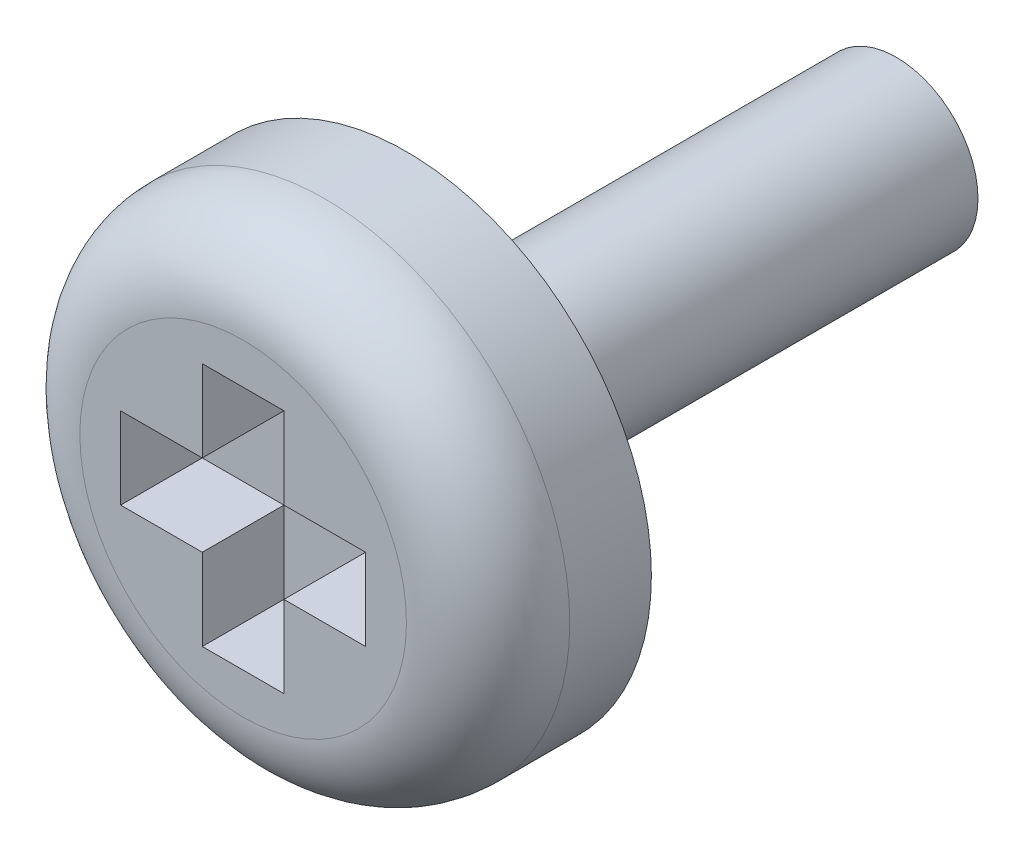
ISO-10303-21;
HEADER;
FILE_DESCRIPTION(('STEP AP214'),'2;1');
FILE_NAME('part.step','',(''),(''),'','','');
FILE_SCHEMA(('AUTOMOTIVE_DESIGN { 1 0 10303 214 1 1 1 1 }'));
ENDSEC;
DATA;
#1=APPLICATION_CONTEXT('core data for automotive mechanical design processes');
#2=APPLICATION_PROTOCOL_DEFINITION('international standard','automotive_design',2000,#1);
#3=PRODUCT_CONTEXT('',#1,'mechanical');
#4=PRODUCT('Part','Part','',(#3));
#5=PRODUCT_RELATED_PRODUCT_CATEGORY('part','',(#4));
#6=PRODUCT_DEFINITION_FORMATION('','',#4);
#7=PRODUCT_DEFINITION_CONTEXT('part definition',#1,'design');
#8=PRODUCT_DEFINITION('design','',#6,#7);
#9=PRODUCT_DEFINITION_SHAPE('','',#8);
#10=(LENGTH_UNIT() NAMED_UNIT(*) SI_UNIT(.MILLI.,.METRE.));
#11=(NAMED_UNIT(*) PLANE_ANGLE_UNIT() SI_UNIT($,.RADIAN.));
#12=(NAMED_UNIT(*) SI_UNIT($,.STERADIAN.) SOLID_ANGLE_UNIT());
#13=UNCERTAINTY_MEASURE_WITH_UNIT(LENGTH_MEASURE(1.E-05),#10,'distance_accuracy_value','');
#14=(GEOMETRIC_REPRESENTATION_CONTEXT(3) GLOBAL_UNCERTAINTY_ASSIGNED_CONTEXT((#13)) GLOBAL_UNIT_ASSIGNED_CONTEXT((#10,
#11,#12)) REPRESENTATION_CONTEXT('',''));
#15=CARTESIAN_POINT('',(0.,0.,0.));
#16=DIRECTION('',(0.,0.,1.));
#17=DIRECTION('',(1.,0.,0.));
#18=AXIS2_PLACEMENT_3D('',#15,#16,#17);
#19=CARTESIAN_POINT('',(0.,0.,3.));
#20=DIRECTION('',(0.,0.,-1.));
#21=DIRECTION('',(-1.,0.,0.));
#22=AXIS2_PLACEMENT_3D('',#19,#20,#21);
#23=CYLINDRICAL_SURFACE('',#22,0.5);
#24=CARTESIAN_POINT('',(0.,0.,3.));
#25=DIRECTION('',(0.,0.,1.));
#26=DIRECTION('',(1.,0.,0.));
#27=AXIS2_PLACEMENT_3D('',#24,#25,#26);
#28=CIRCLE('',#27,0.5);
#29=CARTESIAN_POINT('',(0.5,0.,3.));
#30=VERTEX_POINT('',#29);
#31=EDGE_CURVE('E211',#30,#30,#28,.T.);
#32=ORIENTED_EDGE('',*,*,#31,.F.);
#33=EDGE_LOOP('',(#32));
#34=FACE_BOUND('',#33,.T.);
#35=CARTESIAN_POINT('',(0.,0.,0.));
#36=DIRECTION('',(0.,0.,1.));
#37=DIRECTION('',(1.,0.,0.));
#38=AXIS2_PLACEMENT_3D('',#35,#36,#37);
#39=CIRCLE('',#38,0.5);
#40=CARTESIAN_POINT('',(0.5,0.,0.));
#41=VERTEX_POINT('',#40);
#42=EDGE_CURVE('E210',#41,#41,#39,.T.);
#43=ORIENTED_EDGE('',*,*,#42,.T.);
#44=EDGE_LOOP('',(#43));
#45=FACE_BOUND('',#44,.T.);
#46=ADVANCED_FACE('F34',(#34,#45),#23,.T.);
#47=CARTESIAN_POINT('',(0.,0.,0.));
#48=DIRECTION('',(0.,0.,1.));
#49=DIRECTION('',(1.,0.,0.));
#50=AXIS2_PLACEMENT_3D('',#47,#48,#49);
#51=PLANE('',#50);
#52=ORIENTED_EDGE('',*,*,#42,.F.);
#53=EDGE_LOOP('',(#52));
#54=FACE_BOUND('',#53,.T.);
#55=ADVANCED_FACE('F234',(#54),#51,.F.);
#56=CARTESIAN_POINT('',(0.,0.,4.));
#57=DIRECTION('',(0.,0.,-1.));
#58=DIRECTION('',(-1.,0.,0.));
#59=AXIS2_PLACEMENT_3D('',#56,#57,#58);
#60=CYLINDRICAL_SURFACE('',#59,1.5);
#61=CARTESIAN_POINT('',(0.,0.,3.5));
#62=DIRECTION('',(0.,0.,1.));
#63=DIRECTION('',(1.,0.,0.));
#64=AXIS2_PLACEMENT_3D('',#61,#62,#63);
#65=CIRCLE('',#64,1.5);
#66=CARTESIAN_POINT('',(1.5,0.,3.5));
#67=VERTEX_POINT('',#66);
#68=EDGE_CURVE('E11',#67,#67,#65,.F.);
#69=ORIENTED_EDGE('',*,*,#68,.T.);
#70=EDGE_LOOP('',(#69));
#71=FACE_BOUND('',#70,.T.);
#72=CARTESIAN_POINT('',(0.,0.,3.));
#73=DIRECTION('',(0.,0.,1.));
#74=DIRECTION('',(1.,0.,0.));
#75=AXIS2_PLACEMENT_3D('',#72,#73,#74);
#76=CIRCLE('',#75,1.5);
#77=CARTESIAN_POINT('',(1.5,0.,3.));
#78=VERTEX_POINT('',#77);
#79=EDGE_CURVE('E190',#78,#78,#76,.T.);
#80=ORIENTED_EDGE('',*,*,#79,.T.);
#81=EDGE_LOOP('',(#80));
#82=FACE_BOUND('',#81,.T.);
#83=ADVANCED_FACE('F239',(#71,#82),#60,.T.);
#84=CARTESIAN_POINT('',(0.,0.,4.));
#85=DIRECTION('',(0.,0.,1.));
#86=DIRECTION('',(1.,0.,0.));
#87=AXIS2_PLACEMENT_3D('',#84,#85,#86);
#88=PLANE('',#87);
#89=DIRECTION('',(0.,-1.,0.));
#90=VECTOR('',#89,1.);
#91=CARTESIAN_POINT('',(-0.75,0.25,4.));
#92=LINE('',#91,#90);
#93=CARTESIAN_POINT('',(-0.75,0.25,4.));
#94=VERTEX_POINT('',#93);
#95=CARTESIAN_POINT('',(-0.75,-0.25,4.));
#96=VERTEX_POINT('',#95);
#97=EDGE_CURVE('E49',#94,#96,#92,.T.);
#98=ORIENTED_EDGE('',*,*,#97,.F.);
#99=DIRECTION('',(-1.,0.,0.));
#100=VECTOR('',#99,1.);
#101=CARTESIAN_POINT('',(-0.75,0.25,4.));
#102=LINE('',#101,#100);
#103=CARTESIAN_POINT('',(-0.25,0.25,4.));
#104=VERTEX_POINT('',#103);
#105=EDGE_CURVE('E186',#104,#94,#102,.T.);
#106=ORIENTED_EDGE('',*,*,#105,.F.);
#107=DIRECTION('',(0.,-1.,0.));
#108=VECTOR('',#107,1.);
#109=CARTESIAN_POINT('',(-0.25,0.75,4.));
#110=LINE('',#109,#108);
#111=CARTESIAN_POINT('',(-0.25,0.75,4.));
#112=VERTEX_POINT('',#111);
#113=EDGE_CURVE('E184',#112,#104,#110,.T.);
#114=ORIENTED_EDGE('',*,*,#113,.F.);
#115=DIRECTION('',(-1.,0.,0.));
#116=VECTOR('',#115,1.);
#117=CARTESIAN_POINT('',(-0.25,0.75,4.));
#118=LINE('',#117,#116);
#119=CARTESIAN_POINT('',(0.25,0.75,4.));
#120=VERTEX_POINT('',#119);
#121=EDGE_CURVE('E133',#120,#112,#118,.T.);
#122=ORIENTED_EDGE('',*,*,#121,.F.);
#123=DIRECTION('',(0.,1.,0.));
#124=VECTOR('',#123,1.);
#125=CARTESIAN_POINT('',(0.25,0.75,4.));
#126=LINE('',#125,#124);
#127=CARTESIAN_POINT('',(0.25,0.25,4.));
#128=VERTEX_POINT('',#127);
#129=EDGE_CURVE('E180',#128,#120,#126,.T.);
#130=ORIENTED_EDGE('',*,*,#129,.F.);
#131=DIRECTION('',(-1.,0.,0.));
#132=VECTOR('',#131,1.);
#133=CARTESIAN_POINT('',(0.25,0.25,4.));
#134=LINE('',#133,#132);
#135=CARTESIAN_POINT('',(0.75,0.25,4.));
#136=VERTEX_POINT('',#135);
#137=EDGE_CURVE('E177',#136,#128,#134,.T.);
#138=ORIENTED_EDGE('',*,*,#137,.F.);
#139=DIRECTION('',(0.,1.,0.));
#140=VECTOR('',#139,1.);
#141=CARTESIAN_POINT('',(0.75,0.25,4.));
#142=LINE('',#141,#140);
#143=CARTESIAN_POINT('',(0.75,-0.25,4.));
#144=VERTEX_POINT('',#143);
#145=EDGE_CURVE('E174',#144,#136,#142,.T.);
#146=ORIENTED_EDGE('',*,*,#145,.F.);
#147=DIRECTION('',(1.,0.,0.));
#148=VECTOR('',#147,1.);
#149=CARTESIAN_POINT('',(0.25,-0.25,4.));
#150=LINE('',#149,#148);
#151=CARTESIAN_POINT('',(0.25,-0.25,4.));
#152=VERTEX_POINT('',#151);
#153=EDGE_CURVE('E171',#152,#144,#150,.T.);
#154=ORIENTED_EDGE('',*,*,#153,.F.);
#155=DIRECTION('',(0.,1.,0.));
#156=VECTOR('',#155,1.);
#157=CARTESIAN_POINT('',(0.25,-0.25,4.));
#158=LINE('',#157,#156);
#159=CARTESIAN_POINT('',(0.25,-0.75,4.));
#160=VERTEX_POINT('',#159);
#161=EDGE_CURVE('E168',#160,#152,#158,.T.);
#162=ORIENTED_EDGE('',*,*,#161,.F.);
#163=DIRECTION('',(1.,0.,0.));
#164=VECTOR('',#163,1.);
#165=CARTESIAN_POINT('',(-0.25,-0.75,4.));
#166=LINE('',#165,#164);
#167=CARTESIAN_POINT('',(-0.25,-0.75,4.));
#168=VERTEX_POINT('',#167);
#169=EDGE_CURVE('E165',#168,#160,#166,.T.);
#170=ORIENTED_EDGE('',*,*,#169,.F.);
#171=DIRECTION('',(0.,-1.,0.));
#172=VECTOR('',#171,1.);
#173=CARTESIAN_POINT('',(-0.25,-0.25,4.));
#174=LINE('',#173,#172);
#175=CARTESIAN_POINT('',(-0.25,-0.25,4.));
#176=VERTEX_POINT('',#175);
#177=EDGE_CURVE('E162',#176,#168,#174,.T.);
#178=ORIENTED_EDGE('',*,*,#177,.F.);
#179=DIRECTION('',(1.,0.,0.));
#180=VECTOR('',#179,1.);
#181=CARTESIAN_POINT('',(-0.75,-0.25,4.));
#182=LINE('',#181,#180);
#183=EDGE_CURVE('E159',#96,#176,#182,.T.);
#184=ORIENTED_EDGE('',*,*,#183,.F.);
#185=EDGE_LOOP('',(#98,#106,#114,#122,#130,#138,#146,#154,#162,#170,#178,#184));
#186=FACE_BOUND('',#185,.T.);
#187=CARTESIAN_POINT('',(0.,0.,4.));
#188=DIRECTION('',(0.,0.,1.));
#189=DIRECTION('',(1.,0.,0.));
#190=AXIS2_PLACEMENT_3D('',#187,#188,#189);
#191=CIRCLE('',#190,1.);
#192=CARTESIAN_POINT('',(1.,0.,4.));
#193=VERTEX_POINT('',#192);
#194=EDGE_CURVE('E42',#193,#193,#191,.T.);
#195=ORIENTED_EDGE('',*,*,#194,.T.);
#196=EDGE_LOOP('',(#195));
#197=FACE_BOUND('',#196,.T.);
#198=ADVANCED_FACE('F218',(#186,#197),#88,.T.);
#199=CARTESIAN_POINT('',(0.,0.,3.));
#200=DIRECTION('',(0.,0.,1.));
#201=DIRECTION('',(1.,0.,0.));
#202=AXIS2_PLACEMENT_3D('',#199,#200,#201);
#203=PLANE('',#202);
#204=ORIENTED_EDGE('',*,*,#31,.T.);
#205=EDGE_LOOP('',(#204));
#206=FACE_BOUND('',#205,.T.);
#207=ORIENTED_EDGE('',*,*,#79,.F.);
#208=EDGE_LOOP('',(#207));
#209=FACE_BOUND('',#208,.T.);
#210=ADVANCED_FACE('F222',(#206,#209),#203,.F.);
#211=CARTESIAN_POINT('',(0.,0.,3.5));
#212=DIRECTION('',(0.,0.,1.));
#213=DIRECTION('',(1.,0.,0.));
#214=AXIS2_PLACEMENT_3D('',#211,#212,#213);
#215=TOROIDAL_SURFACE('',#214,1.,0.5);
#216=ORIENTED_EDGE('',*,*,#68,.F.);
#217=EDGE_LOOP('',(#216));
#218=FACE_BOUND('',#217,.T.);
#219=ORIENTED_EDGE('',*,*,#194,.F.);
#220=EDGE_LOOP('',(#219));
#221=FACE_BOUND('',#220,.T.);
#222=ADVANCED_FACE('F36',(#218,#221),#215,.T.);
#223=CARTESIAN_POINT('',(-0.75,0.25,3.5));
#224=DIRECTION('',(-1.,0.,0.));
#225=DIRECTION('',(0.,-1.,0.));
#226=AXIS2_PLACEMENT_3D('',#223,#224,#225);
#227=PLANE('',#226);
#228=ORIENTED_EDGE('',*,*,#97,.T.);
#229=DIRECTION('',(0.,0.,1.));
#230=VECTOR('',#229,1.);
#231=CARTESIAN_POINT('',(-0.75,-0.25,3.5));
#232=LINE('',#231,#230);
#233=CARTESIAN_POINT('',(-0.75,-0.25,3.5));
#234=VERTEX_POINT('',#233);
#235=EDGE_CURVE('E97',#234,#96,#232,.T.);
#236=ORIENTED_EDGE('',*,*,#235,.F.);
#237=DIRECTION('',(0.,-1.,0.));
#238=VECTOR('',#237,1.);
#239=CARTESIAN_POINT('',(-0.75,0.25,3.5));
#240=LINE('',#239,#238);
#241=CARTESIAN_POINT('',(-0.75,0.25,3.5));
#242=VERTEX_POINT('',#241);
#243=EDGE_CURVE('E188',#242,#234,#240,.T.);
#244=ORIENTED_EDGE('',*,*,#243,.F.);
#245=DIRECTION('',(0.,0.,1.));
#246=VECTOR('',#245,1.);
#247=CARTESIAN_POINT('',(-0.75,0.25,3.5));
#248=LINE('',#247,#246);
#249=EDGE_CURVE('E57',#242,#94,#248,.T.);
#250=ORIENTED_EDGE('',*,*,#249,.T.);
#251=EDGE_LOOP('',(#228,#236,#244,#250));
#252=FACE_BOUND('',#251,.T.);
#253=ADVANCED_FACE('F221',(#252),#227,.F.);
#254=CARTESIAN_POINT('',(-0.75,0.25,3.5));
#255=DIRECTION('',(0.,1.,0.));
#256=DIRECTION('',(-1.,0.,0.));
#257=AXIS2_PLACEMENT_3D('',#254,#255,#256);
#258=PLANE('',#257);
#259=ORIENTED_EDGE('',*,*,#105,.T.);
#260=ORIENTED_EDGE('',*,*,#249,.F.);
#261=DIRECTION('',(-1.,0.,0.));
#262=VECTOR('',#261,1.);
#263=CARTESIAN_POINT('',(-0.75,0.25,3.5));
#264=LINE('',#263,#262);
#265=CARTESIAN_POINT('',(-0.25,0.25,3.5));
#266=VERTEX_POINT('',#265);
#267=EDGE_CURVE('E145',#266,#242,#264,.T.);
#268=ORIENTED_EDGE('',*,*,#267,.F.);
#269=DIRECTION('',(0.,0.,1.));
#270=VECTOR('',#269,1.);
#271=CARTESIAN_POINT('',(-0.25,0.25,3.5));
#272=LINE('',#271,#270);
#273=EDGE_CURVE('E137',#266,#104,#272,.T.);
#274=ORIENTED_EDGE('',*,*,#273,.T.);
#275=EDGE_LOOP('',(#259,#260,#268,#274));
#276=FACE_BOUND('',#275,.T.);
#277=ADVANCED_FACE('F228',(#276),#258,.F.);
#278=CARTESIAN_POINT('',(-0.25,0.75,3.5));
#279=DIRECTION('',(-1.,0.,0.));
#280=DIRECTION('',(0.,-1.,0.));
#281=AXIS2_PLACEMENT_3D('',#278,#279,#280);
#282=PLANE('',#281);
#283=ORIENTED_EDGE('',*,*,#113,.T.);
#284=ORIENTED_EDGE('',*,*,#273,.F.);
#285=DIRECTION('',(0.,-1.,0.));
#286=VECTOR('',#285,1.);
#287=CARTESIAN_POINT('',(-0.25,0.75,3.5));
#288=LINE('',#287,#286);
#289=CARTESIAN_POINT('',(-0.25,0.75,3.5));
#290=VERTEX_POINT('',#289);
#291=EDGE_CURVE('E141',#290,#266,#288,.T.);
#292=ORIENTED_EDGE('',*,*,#291,.F.);
#293=DIRECTION('',(0.,0.,1.));
#294=VECTOR('',#293,1.);
#295=CARTESIAN_POINT('',(-0.25,0.75,3.5));
#296=LINE('',#295,#294);
#297=EDGE_CURVE('E126',#290,#112,#296,.T.);
#298=ORIENTED_EDGE('',*,*,#297,.T.);
#299=EDGE_LOOP('',(#283,#284,#292,#298));
#300=FACE_BOUND('',#299,.T.);
#301=ADVANCED_FACE('F142',(#300),#282,.F.);
#302=CARTESIAN_POINT('',(-0.25,0.75,3.5));
#303=DIRECTION('',(0.,1.,0.));
#304=DIRECTION('',(0.,0.,1.));
#305=AXIS2_PLACEMENT_3D('',#302,#303,#304);
#306=PLANE('',#305);
#307=ORIENTED_EDGE('',*,*,#121,.T.);
#308=ORIENTED_EDGE('',*,*,#297,.F.);
#309=DIRECTION('',(-1.,0.,0.));
#310=VECTOR('',#309,1.);
#311=CARTESIAN_POINT('',(-0.25,0.75,3.5));
#312=LINE('',#311,#310);
#313=CARTESIAN_POINT('',(0.25,0.75,3.5));
#314=VERTEX_POINT('',#313);
#315=EDGE_CURVE('E130',#314,#290,#312,.T.);
#316=ORIENTED_EDGE('',*,*,#315,.F.);
#317=DIRECTION('',(0.,0.,1.));
#318=VECTOR('',#317,1.);
#319=CARTESIAN_POINT('',(0.25,0.75,3.5));
#320=LINE('',#319,#318);
#321=EDGE_CURVE('E138',#314,#120,#320,.T.);
#322=ORIENTED_EDGE('',*,*,#321,.T.);
#323=EDGE_LOOP('',(#307,#308,#316,#322));
#324=FACE_BOUND('',#323,.T.);
#325=ADVANCED_FACE('F128',(#324),#306,.F.);
#326=CARTESIAN_POINT('',(0.25,0.75,3.5));
#327=DIRECTION('',(1.,0.,0.));
#328=DIRECTION('',(0.,1.,0.));
#329=AXIS2_PLACEMENT_3D('',#326,#327,#328);
#330=PLANE('',#329);
#331=ORIENTED_EDGE('',*,*,#129,.T.);
#332=ORIENTED_EDGE('',*,*,#321,.F.);
#333=DIRECTION('',(0.,1.,0.));
#334=VECTOR('',#333,1.);
#335=CARTESIAN_POINT('',(0.25,0.75,3.5));
#336=LINE('',#335,#334);
#337=CARTESIAN_POINT('',(0.25,0.25,3.5));
#338=VERTEX_POINT('',#337);
#339=EDGE_CURVE('E151',#338,#314,#336,.T.);
#340=ORIENTED_EDGE('',*,*,#339,.F.);
#341=DIRECTION('',(0.,0.,1.));
#342=VECTOR('',#341,1.);
#343=CARTESIAN_POINT('',(0.25,0.25,3.5));
#344=LINE('',#343,#342);
#345=EDGE_CURVE('E193',#338,#128,#344,.T.);
#346=ORIENTED_EDGE('',*,*,#345,.T.);
#347=EDGE_LOOP('',(#331,#332,#340,#346));
#348=FACE_BOUND('',#347,.T.);
#349=ADVANCED_FACE('F278',(#348),#330,.F.);
#350=CARTESIAN_POINT('',(0.25,0.25,3.5));
#351=DIRECTION('',(0.,1.,0.));
#352=DIRECTION('',(-1.,0.,0.));
#353=AXIS2_PLACEMENT_3D('',#350,#351,#352);
#354=PLANE('',#353);
#355=ORIENTED_EDGE('',*,*,#137,.T.);
#356=ORIENTED_EDGE('',*,*,#345,.F.);
#357=DIRECTION('',(-1.,0.,0.));
#358=VECTOR('',#357,1.);
#359=CARTESIAN_POINT('',(0.25,0.25,3.5));
#360=LINE('',#359,#358);
#361=CARTESIAN_POINT('',(0.75,0.25,3.5));
#362=VERTEX_POINT('',#361);
#363=EDGE_CURVE('E153',#362,#338,#360,.T.);
#364=ORIENTED_EDGE('',*,*,#363,.F.);
#365=DIRECTION('',(0.,0.,1.));
#366=VECTOR('',#365,1.);
#367=CARTESIAN_POINT('',(0.75,0.25,3.5));
#368=LINE('',#367,#366);
#369=EDGE_CURVE('E195',#362,#136,#368,.T.);
#370=ORIENTED_EDGE('',*,*,#369,.T.);
#371=EDGE_LOOP('',(#355,#356,#364,#370));
#372=FACE_BOUND('',#371,.T.);
#373=ADVANCED_FACE('F274',(#372),#354,.F.);
#374=CARTESIAN_POINT('',(0.75,0.25,3.5));
#375=DIRECTION('',(1.,0.,0.));
#376=DIRECTION('',(0.,0.,-1.));
#377=AXIS2_PLACEMENT_3D('',#374,#375,#376);
#378=PLANE('',#377);
#379=ORIENTED_EDGE('',*,*,#145,.T.);
#380=ORIENTED_EDGE('',*,*,#369,.F.);
#381=DIRECTION('',(0.,1.,0.));
#382=VECTOR('',#381,1.);
#383=CARTESIAN_POINT('',(0.75,0.25,3.5));
#384=LINE('',#383,#382);
#385=CARTESIAN_POINT('',(0.75,-0.25,3.5));
#386=VERTEX_POINT('',#385);
#387=EDGE_CURVE('E422',#386,#362,#384,.T.);
#388=ORIENTED_EDGE('',*,*,#387,.F.);
#389=DIRECTION('',(0.,0.,1.));
#390=VECTOR('',#389,1.);
#391=CARTESIAN_POINT('',(0.75,-0.25,3.5));
#392=LINE('',#391,#390);
#393=EDGE_CURVE('E197',#386,#144,#392,.T.);
#394=ORIENTED_EDGE('',*,*,#393,.T.);
#395=EDGE_LOOP('',(#379,#380,#388,#394));
#396=FACE_BOUND('',#395,.T.);
#397=ADVANCED_FACE('F270',(#396),#378,.F.);
#398=CARTESIAN_POINT('',(0.25,-0.25,3.5));
#399=DIRECTION('',(0.,-1.,0.));
#400=DIRECTION('',(0.,0.,-1.));
#401=AXIS2_PLACEMENT_3D('',#398,#399,#400);
#402=PLANE('',#401);
#403=ORIENTED_EDGE('',*,*,#153,.T.);
#404=ORIENTED_EDGE('',*,*,#393,.F.);
#405=DIRECTION('',(1.,0.,0.));
#406=VECTOR('',#405,1.);
#407=CARTESIAN_POINT('',(0.25,-0.25,3.5));
#408=LINE('',#407,#406);
#409=CARTESIAN_POINT('',(0.25,-0.25,3.5));
#410=VERTEX_POINT('',#409);
#411=EDGE_CURVE('E419',#410,#386,#408,.T.);
#412=ORIENTED_EDGE('',*,*,#411,.F.);
#413=DIRECTION('',(0.,0.,1.));
#414=VECTOR('',#413,1.);
#415=CARTESIAN_POINT('',(0.25,-0.25,3.5));
#416=LINE('',#415,#414);
#417=EDGE_CURVE('E199',#410,#152,#416,.T.);
#418=ORIENTED_EDGE('',*,*,#417,.T.);
#419=EDGE_LOOP('',(#403,#404,#412,#418));
#420=FACE_BOUND('',#419,.T.);
#421=ADVANCED_FACE('F266',(#420),#402,.F.);
#422=CARTESIAN_POINT('',(0.25,-0.25,3.5));
#423=DIRECTION('',(1.,0.,0.));
#424=DIRECTION('',(0.,1.,0.));
#425=AXIS2_PLACEMENT_3D('',#422,#423,#424);
#426=PLANE('',#425);
#427=ORIENTED_EDGE('',*,*,#161,.T.);
#428=ORIENTED_EDGE('',*,*,#417,.F.);
#429=DIRECTION('',(0.,1.,0.));
#430=VECTOR('',#429,1.);
#431=CARTESIAN_POINT('',(0.25,-0.25,3.5));
#432=LINE('',#431,#430);
#433=CARTESIAN_POINT('',(0.25,-0.75,3.5));
#434=VERTEX_POINT('',#433);
#435=EDGE_CURVE('E416',#434,#410,#432,.T.);
#436=ORIENTED_EDGE('',*,*,#435,.F.);
#437=DIRECTION('',(0.,0.,1.));
#438=VECTOR('',#437,1.);
#439=CARTESIAN_POINT('',(0.25,-0.75,3.5));
#440=LINE('',#439,#438);
#441=EDGE_CURVE('E201',#434,#160,#440,.T.);
#442=ORIENTED_EDGE('',*,*,#441,.T.);
#443=EDGE_LOOP('',(#427,#428,#436,#442));
#444=FACE_BOUND('',#443,.T.);
#445=ADVANCED_FACE('F262',(#444),#426,.F.);
#446=CARTESIAN_POINT('',(-0.25,-0.75,3.5));
#447=DIRECTION('',(0.,-1.,0.));
#448=DIRECTION('',(0.,0.,-1.));
#449=AXIS2_PLACEMENT_3D('',#446,#447,#448);
#450=PLANE('',#449);
#451=ORIENTED_EDGE('',*,*,#169,.T.);
#452=ORIENTED_EDGE('',*,*,#441,.F.);
#453=DIRECTION('',(1.,0.,0.));
#454=VECTOR('',#453,1.);
#455=CARTESIAN_POINT('',(-0.25,-0.75,3.5));
#456=LINE('',#455,#454);
#457=CARTESIAN_POINT('',(-0.25,-0.75,3.5));
#458=VERTEX_POINT('',#457);
#459=EDGE_CURVE('E413',#458,#434,#456,.T.);
#460=ORIENTED_EDGE('',*,*,#459,.F.);
#461=DIRECTION('',(0.,0.,1.));
#462=VECTOR('',#461,1.);
#463=CARTESIAN_POINT('',(-0.25,-0.75,3.5));
#464=LINE('',#463,#462);
#465=EDGE_CURVE('E203',#458,#168,#464,.T.);
#466=ORIENTED_EDGE('',*,*,#465,.T.);
#467=EDGE_LOOP('',(#451,#452,#460,#466));
#468=FACE_BOUND('',#467,.T.);
#469=ADVANCED_FACE('F258',(#468),#450,.F.);
#470=CARTESIAN_POINT('',(-0.25,-0.25,3.5));
#471=DIRECTION('',(-1.,0.,0.));
#472=DIRECTION('',(0.,-1.,0.));
#473=AXIS2_PLACEMENT_3D('',#470,#471,#472);
#474=PLANE('',#473);
#475=ORIENTED_EDGE('',*,*,#177,.T.);
#476=ORIENTED_EDGE('',*,*,#465,.F.);
#477=DIRECTION('',(0.,-1.,0.));
#478=VECTOR('',#477,1.);
#479=CARTESIAN_POINT('',(-0.25,-0.25,3.5));
#480=LINE('',#479,#478);
#481=CARTESIAN_POINT('',(-0.25,-0.25,3.5));
#482=VERTEX_POINT('',#481);
#483=EDGE_CURVE('E408',#482,#458,#480,.T.);
#484=ORIENTED_EDGE('',*,*,#483,.F.);
#485=DIRECTION('',(0.,0.,1.));
#486=VECTOR('',#485,1.);
#487=CARTESIAN_POINT('',(-0.25,-0.25,3.5));
#488=LINE('',#487,#486);
#489=EDGE_CURVE('E205',#482,#176,#488,.T.);
#490=ORIENTED_EDGE('',*,*,#489,.T.);
#491=EDGE_LOOP('',(#475,#476,#484,#490));
#492=FACE_BOUND('',#491,.T.);
#493=ADVANCED_FACE('F254',(#492),#474,.F.);
#494=CARTESIAN_POINT('',(-0.75,-0.25,3.5));
#495=DIRECTION('',(0.,-1.,0.));
#496=DIRECTION('',(1.,0.,0.));
#497=AXIS2_PLACEMENT_3D('',#494,#495,#496);
#498=PLANE('',#497);
#499=ORIENTED_EDGE('',*,*,#183,.T.);
#500=ORIENTED_EDGE('',*,*,#489,.F.);
#501=DIRECTION('',(1.,0.,0.));
#502=VECTOR('',#501,1.);
#503=CARTESIAN_POINT('',(-0.75,-0.25,3.5));
#504=LINE('',#503,#502);
#505=EDGE_CURVE('E406',#234,#482,#504,.T.);
#506=ORIENTED_EDGE('',*,*,#505,.F.);
#507=ORIENTED_EDGE('',*,*,#235,.T.);
#508=EDGE_LOOP('',(#499,#500,#506,#507));
#509=FACE_BOUND('',#508,.T.);
#510=ADVANCED_FACE('F251',(#509),#498,.F.);
#511=CARTESIAN_POINT('',(0.,0.,3.5));
#512=DIRECTION('',(0.,0.,1.));
#513=DIRECTION('',(1.,0.,0.));
#514=AXIS2_PLACEMENT_3D('',#511,#512,#513);
#515=PLANE('',#514);
#516=ORIENTED_EDGE('',*,*,#243,.T.);
#517=ORIENTED_EDGE('',*,*,#505,.T.);
#518=ORIENTED_EDGE('',*,*,#483,.T.);
#519=ORIENTED_EDGE('',*,*,#459,.T.);
#520=ORIENTED_EDGE('',*,*,#435,.T.);
#521=ORIENTED_EDGE('',*,*,#411,.T.);
#522=ORIENTED_EDGE('',*,*,#387,.T.);
#523=ORIENTED_EDGE('',*,*,#363,.T.);
#524=ORIENTED_EDGE('',*,*,#339,.T.);
#525=ORIENTED_EDGE('',*,*,#315,.T.);
#526=ORIENTED_EDGE('',*,*,#291,.T.);
#527=ORIENTED_EDGE('',*,*,#267,.T.);
#528=EDGE_LOOP('',(#516,#517,#518,#519,#520,#521,#522,#523,#524,#525,#526,#527));
#529=FACE_BOUND('',#528,.T.);
#530=ADVANCED_FACE('F148',(#529),#515,.T.);
#531=CLOSED_SHELL('',(#46,#55,#83,#198,#210,#222,#253,#277,#301,#325,#349,#373,#397,#421,#445,
#469,#493,#510,#530));
#532=MANIFOLD_SOLID_BREP('B2',#531);
#533=ADVANCED_BREP_SHAPE_REPRESENTATION('',(#18,#532),#14);
#534=SHAPE_DEFINITION_REPRESENTATION(#9,#533);
ENDSEC;
END-ISO-10303-21;
